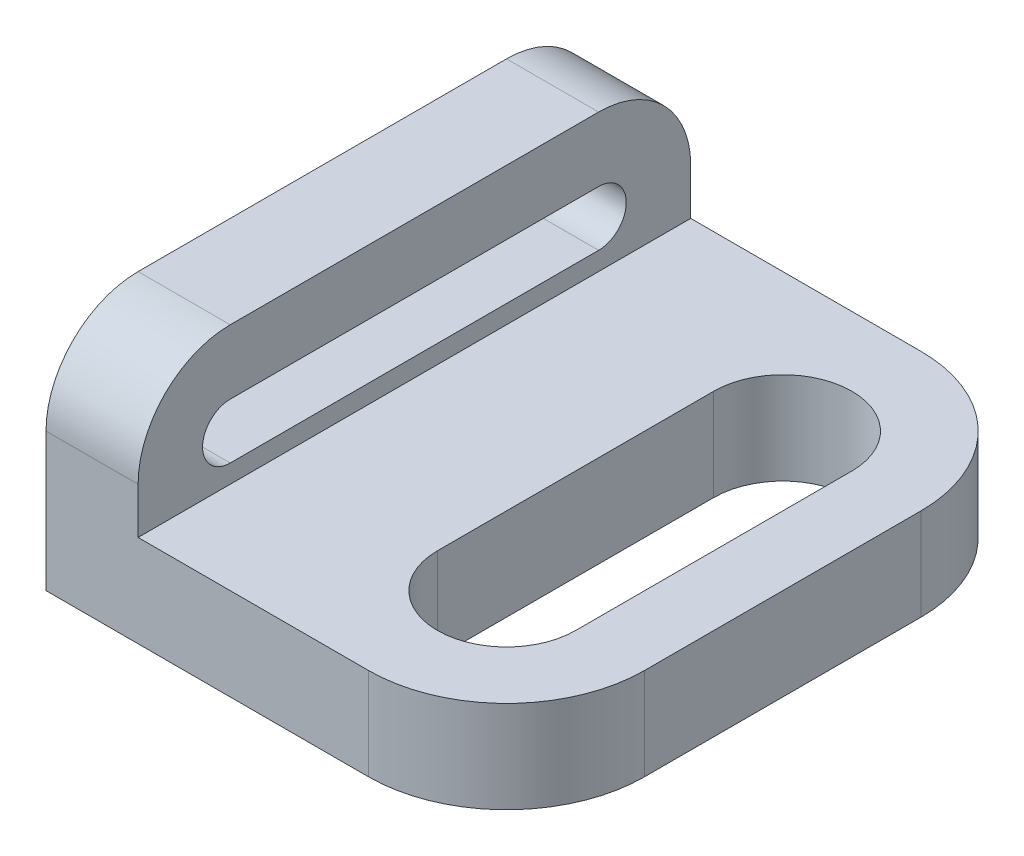
ISO-10303-21;
HEADER;
FILE_DESCRIPTION(('STEP AP214'),'2;1');
FILE_NAME('part.step','',(''),(''),'','','');
FILE_SCHEMA(('AUTOMOTIVE_DESIGN { 1 0 10303 214 1 1 1 1 }'));
ENDSEC;
DATA;
#1=APPLICATION_CONTEXT('core data for automotive mechanical design processes');
#2=APPLICATION_PROTOCOL_DEFINITION('international standard','automotive_design',2000,#1);
#3=PRODUCT_CONTEXT('',#1,'mechanical');
#4=PRODUCT('Part','Part','',(#3));
#5=PRODUCT_RELATED_PRODUCT_CATEGORY('part','',(#4));
#6=PRODUCT_DEFINITION_FORMATION('','',#4);
#7=PRODUCT_DEFINITION_CONTEXT('part definition',#1,'design');
#8=PRODUCT_DEFINITION('design','',#6,#7);
#9=PRODUCT_DEFINITION_SHAPE('','',#8);
#10=(LENGTH_UNIT() NAMED_UNIT(*) SI_UNIT(.MILLI.,.METRE.));
#11=(NAMED_UNIT(*) PLANE_ANGLE_UNIT() SI_UNIT($,.RADIAN.));
#12=(NAMED_UNIT(*) SI_UNIT($,.STERADIAN.) SOLID_ANGLE_UNIT());
#13=UNCERTAINTY_MEASURE_WITH_UNIT(LENGTH_MEASURE(1.E-05),#10,'distance_accuracy_value','');
#14=(GEOMETRIC_REPRESENTATION_CONTEXT(3) GLOBAL_UNCERTAINTY_ASSIGNED_CONTEXT((#13)) GLOBAL_UNIT_ASSIGNED_CONTEXT((#10,
#11,#12)) REPRESENTATION_CONTEXT('',''));
#15=CARTESIAN_POINT('',(0.,0.,0.));
#16=DIRECTION('',(0.,0.,1.));
#17=DIRECTION('',(1.,0.,0.));
#18=AXIS2_PLACEMENT_3D('',#15,#16,#17);
#19=CARTESIAN_POINT('',(0.,20.,0.));
#20=DIRECTION('',(0.,1.,0.));
#21=DIRECTION('',(0.,0.,1.));
#22=AXIS2_PLACEMENT_3D('',#19,#20,#21);
#23=PLANE('',#22);
#24=DIRECTION('',(0.,0.,-1.));
#25=VECTOR('',#24,1.);
#26=CARTESIAN_POINT('',(-30.,20.,-60.));
#27=LINE('',#26,#25);
#28=CARTESIAN_POINT('',(-30.,20.,60.));
#29=VERTEX_POINT('',#28);
#30=CARTESIAN_POINT('',(-30.,20.,-60.));
#31=VERTEX_POINT('',#30);
#32=EDGE_CURVE('E201',#29,#31,#27,.T.);
#33=ORIENTED_EDGE('',*,*,#32,.F.);
#34=DIRECTION('',(1.,0.,0.));
#35=VECTOR('',#34,1.);
#36=CARTESIAN_POINT('',(-50.,20.,60.));
#37=LINE('',#36,#35);
#38=CARTESIAN_POINT('',(20.,20.,60.));
#39=VERTEX_POINT('',#38);
#40=EDGE_CURVE('E253',#29,#39,#37,.T.);
#41=ORIENTED_EDGE('',*,*,#40,.T.);
#42=CARTESIAN_POINT('',(20.,20.,30.));
#43=DIRECTION('',(0.,1.,0.));
#44=DIRECTION('',(0.,0.,1.));
#45=AXIS2_PLACEMENT_3D('',#42,#43,#44);
#46=CIRCLE('',#45,30.);
#47=CARTESIAN_POINT('',(50.,20.,30.));
#48=VERTEX_POINT('',#47);
#49=EDGE_CURVE('E287',#39,#48,#46,.T.);
#50=ORIENTED_EDGE('',*,*,#49,.T.);
#51=DIRECTION('',(0.,0.,-1.));
#52=VECTOR('',#51,1.);
#53=CARTESIAN_POINT('',(50.,20.,-60.));
#54=LINE('',#53,#52);
#55=CARTESIAN_POINT('',(50.,20.,-30.));
#56=VERTEX_POINT('',#55);
#57=EDGE_CURVE('E247',#48,#56,#54,.T.);
#58=ORIENTED_EDGE('',*,*,#57,.T.);
#59=CARTESIAN_POINT('',(20.,20.,-30.));
#60=DIRECTION('',(0.,1.,0.));
#61=DIRECTION('',(0.,0.,1.));
#62=AXIS2_PLACEMENT_3D('',#59,#60,#61);
#63=CIRCLE('',#62,30.);
#64=CARTESIAN_POINT('',(20.,20.,-60.));
#65=VERTEX_POINT('',#64);
#66=EDGE_CURVE('E277',#56,#65,#63,.T.);
#67=ORIENTED_EDGE('',*,*,#66,.T.);
#68=DIRECTION('',(-1.,0.,0.));
#69=VECTOR('',#68,1.);
#70=CARTESIAN_POINT('',(-50.,20.,-60.));
#71=LINE('',#70,#69);
#72=EDGE_CURVE('E249',#65,#31,#71,.T.);
#73=ORIENTED_EDGE('',*,*,#72,.T.);
#74=EDGE_LOOP('',(#33,#41,#50,#58,#67,#73));
#75=FACE_BOUND('',#74,.T.);
#76=DIRECTION('',(0.,0.,1.));
#77=VECTOR('',#76,1.);
#78=CARTESIAN_POINT('',(5.,20.,-30.));
#79=LINE('',#78,#77);
#80=CARTESIAN_POINT('',(5.,20.,-30.));
#81=VERTEX_POINT('',#80);
#82=CARTESIAN_POINT('',(5.,20.,30.));
#83=VERTEX_POINT('',#82);
#84=EDGE_CURVE('E218',#81,#83,#79,.T.);
#85=ORIENTED_EDGE('',*,*,#84,.F.);
#86=CARTESIAN_POINT('',(20.,20.,-30.));
#87=DIRECTION('',(0.,1.,0.));
#88=DIRECTION('',(0.,0.,1.));
#89=AXIS2_PLACEMENT_3D('',#86,#87,#88);
#90=CIRCLE('',#89,15.);
#91=CARTESIAN_POINT('',(35.,20.,-30.));
#92=VERTEX_POINT('',#91);
#93=EDGE_CURVE('E216',#92,#81,#90,.T.);
#94=ORIENTED_EDGE('',*,*,#93,.F.);
#95=DIRECTION('',(0.,0.,-1.));
#96=VECTOR('',#95,1.);
#97=CARTESIAN_POINT('',(35.,20.,-30.));
#98=LINE('',#97,#96);
#99=CARTESIAN_POINT('',(35.,20.,30.));
#100=VERTEX_POINT('',#99);
#101=EDGE_CURVE('E224',#100,#92,#98,.T.);
#102=ORIENTED_EDGE('',*,*,#101,.F.);
#103=CARTESIAN_POINT('',(20.,20.,30.));
#104=DIRECTION('',(0.,1.,0.));
#105=DIRECTION('',(0.,0.,1.));
#106=AXIS2_PLACEMENT_3D('',#103,#104,#105);
#107=CIRCLE('',#106,15.);
#108=EDGE_CURVE('E221',#83,#100,#107,.T.);
#109=ORIENTED_EDGE('',*,*,#108,.F.);
#110=EDGE_LOOP('',(#85,#94,#102,#109));
#111=FACE_BOUND('',#110,.T.);
#112=ADVANCED_FACE('F39',(#75,#111),#23,.T.);
#113=CARTESIAN_POINT('',(0.,0.,0.));
#114=DIRECTION('',(0.,1.,0.));
#115=DIRECTION('',(0.,0.,1.));
#116=AXIS2_PLACEMENT_3D('',#113,#114,#115);
#117=PLANE('',#116);
#118=DIRECTION('',(0.,0.,-1.));
#119=VECTOR('',#118,1.);
#120=CARTESIAN_POINT('',(50.,0.,-60.));
#121=LINE('',#120,#119);
#122=CARTESIAN_POINT('',(50.,0.,30.));
#123=VERTEX_POINT('',#122);
#124=CARTESIAN_POINT('',(50.,0.,-30.));
#125=VERTEX_POINT('',#124);
#126=EDGE_CURVE('E246',#123,#125,#121,.T.);
#127=ORIENTED_EDGE('',*,*,#126,.F.);
#128=CARTESIAN_POINT('',(20.,0.,30.));
#129=DIRECTION('',(0.,1.,0.));
#130=DIRECTION('',(0.,0.,1.));
#131=AXIS2_PLACEMENT_3D('',#128,#129,#130);
#132=CIRCLE('',#131,30.);
#133=CARTESIAN_POINT('',(20.,0.,60.));
#134=VERTEX_POINT('',#133);
#135=EDGE_CURVE('E282',#123,#134,#132,.F.);
#136=ORIENTED_EDGE('',*,*,#135,.T.);
#137=DIRECTION('',(1.,0.,0.));
#138=VECTOR('',#137,1.);
#139=CARTESIAN_POINT('',(-50.,0.,60.));
#140=LINE('',#139,#138);
#141=CARTESIAN_POINT('',(-50.,0.,60.));
#142=VERTEX_POINT('',#141);
#143=EDGE_CURVE('E250',#142,#134,#140,.T.);
#144=ORIENTED_EDGE('',*,*,#143,.F.);
#145=DIRECTION('',(0.,0.,1.));
#146=VECTOR('',#145,1.);
#147=CARTESIAN_POINT('',(-50.,0.,-60.));
#148=LINE('',#147,#146);
#149=CARTESIAN_POINT('',(-50.,0.,-60.));
#150=VERTEX_POINT('',#149);
#151=EDGE_CURVE('E260',#150,#142,#148,.T.);
#152=ORIENTED_EDGE('',*,*,#151,.F.);
#153=DIRECTION('',(-1.,0.,0.));
#154=VECTOR('',#153,1.);
#155=CARTESIAN_POINT('',(-50.,0.,-60.));
#156=LINE('',#155,#154);
#157=CARTESIAN_POINT('',(20.,0.,-60.));
#158=VERTEX_POINT('',#157);
#159=EDGE_CURVE('E257',#158,#150,#156,.T.);
#160=ORIENTED_EDGE('',*,*,#159,.F.);
#161=CARTESIAN_POINT('',(20.,0.,-30.));
#162=DIRECTION('',(0.,1.,0.));
#163=DIRECTION('',(0.,0.,1.));
#164=AXIS2_PLACEMENT_3D('',#161,#162,#163);
#165=CIRCLE('',#164,30.);
#166=EDGE_CURVE('E271',#158,#125,#165,.F.);
#167=ORIENTED_EDGE('',*,*,#166,.T.);
#168=EDGE_LOOP('',(#127,#136,#144,#152,#160,#167));
#169=FACE_BOUND('',#168,.T.);
#170=CARTESIAN_POINT('',(20.,0.,-30.));
#171=DIRECTION('',(0.,1.,0.));
#172=DIRECTION('',(0.,0.,1.));
#173=AXIS2_PLACEMENT_3D('',#170,#171,#172);
#174=CIRCLE('',#173,15.);
#175=CARTESIAN_POINT('',(35.,0.,-30.));
#176=VERTEX_POINT('',#175);
#177=CARTESIAN_POINT('',(5.,0.,-30.));
#178=VERTEX_POINT('',#177);
#179=EDGE_CURVE('E215',#176,#178,#174,.T.);
#180=ORIENTED_EDGE('',*,*,#179,.T.);
#181=DIRECTION('',(0.,0.,1.));
#182=VECTOR('',#181,1.);
#183=CARTESIAN_POINT('',(5.,0.,-30.));
#184=LINE('',#183,#182);
#185=CARTESIAN_POINT('',(5.,0.,30.));
#186=VERTEX_POINT('',#185);
#187=EDGE_CURVE('E229',#178,#186,#184,.T.);
#188=ORIENTED_EDGE('',*,*,#187,.T.);
#189=CARTESIAN_POINT('',(20.,0.,30.));
#190=DIRECTION('',(0.,1.,0.));
#191=DIRECTION('',(0.,0.,1.));
#192=AXIS2_PLACEMENT_3D('',#189,#190,#191);
#193=CIRCLE('',#192,15.);
#194=CARTESIAN_POINT('',(35.,0.,30.));
#195=VERTEX_POINT('',#194);
#196=EDGE_CURVE('E232',#186,#195,#193,.T.);
#197=ORIENTED_EDGE('',*,*,#196,.T.);
#198=DIRECTION('',(0.,0.,-1.));
#199=VECTOR('',#198,1.);
#200=CARTESIAN_POINT('',(35.,0.,-30.));
#201=LINE('',#200,#199);
#202=EDGE_CURVE('E219',#195,#176,#201,.T.);
#203=ORIENTED_EDGE('',*,*,#202,.T.);
#204=EDGE_LOOP('',(#180,#188,#197,#203));
#205=FACE_BOUND('',#204,.T.);
#206=ADVANCED_FACE('F329',(#169,#205),#117,.F.);
#207=CARTESIAN_POINT('',(50.,20.,-60.));
#208=DIRECTION('',(-1.,0.,0.));
#209=DIRECTION('',(0.,0.,1.));
#210=AXIS2_PLACEMENT_3D('',#207,#208,#209);
#211=PLANE('',#210);
#212=ORIENTED_EDGE('',*,*,#57,.F.);
#213=DIRECTION('',(0.,-1.,0.));
#214=VECTOR('',#213,1.);
#215=CARTESIAN_POINT('',(50.,20.,30.));
#216=LINE('',#215,#214);
#217=EDGE_CURVE('E279',#48,#123,#216,.T.);
#218=ORIENTED_EDGE('',*,*,#217,.T.);
#219=ORIENTED_EDGE('',*,*,#126,.T.);
#220=DIRECTION('',(0.,-1.,0.));
#221=VECTOR('',#220,1.);
#222=CARTESIAN_POINT('',(50.,20.,-30.));
#223=LINE('',#222,#221);
#224=EDGE_CURVE('E274',#125,#56,#223,.F.);
#225=ORIENTED_EDGE('',*,*,#224,.T.);
#226=EDGE_LOOP('',(#212,#218,#219,#225));
#227=FACE_BOUND('',#226,.T.);
#228=ADVANCED_FACE('F335',(#227),#211,.F.);
#229=CARTESIAN_POINT('',(-50.,20.,-60.));
#230=DIRECTION('',(0.,0.,1.));
#231=DIRECTION('',(1.,0.,0.));
#232=AXIS2_PLACEMENT_3D('',#229,#230,#231);
#233=PLANE('',#232);
#234=DIRECTION('',(0.,-1.,0.));
#235=VECTOR('',#234,1.);
#236=CARTESIAN_POINT('',(-50.,20.,-60.));
#237=LINE('',#236,#235);
#238=CARTESIAN_POINT('',(-50.,30.,-60.));
#239=VERTEX_POINT('',#238);
#240=EDGE_CURVE('E266',#239,#150,#237,.T.);
#241=ORIENTED_EDGE('',*,*,#240,.F.);
#242=DIRECTION('',(-1.,0.,0.));
#243=VECTOR('',#242,1.);
#244=CARTESIAN_POINT('',(-30.,30.,-60.));
#245=LINE('',#244,#243);
#246=CARTESIAN_POINT('',(-30.,30.,-60.));
#247=VERTEX_POINT('',#246);
#248=EDGE_CURVE('E11',#239,#247,#245,.F.);
#249=ORIENTED_EDGE('',*,*,#248,.T.);
#250=DIRECTION('',(0.,-1.,0.));
#251=VECTOR('',#250,1.);
#252=CARTESIAN_POINT('',(-30.,50.,-60.));
#253=LINE('',#252,#251);
#254=EDGE_CURVE('E213',#247,#31,#253,.T.);
#255=ORIENTED_EDGE('',*,*,#254,.T.);
#256=ORIENTED_EDGE('',*,*,#72,.F.);
#257=DIRECTION('',(0.,-1.,0.));
#258=VECTOR('',#257,1.);
#259=CARTESIAN_POINT('',(20.,20.,-60.));
#260=LINE('',#259,#258);
#261=EDGE_CURVE('E268',#65,#158,#260,.T.);
#262=ORIENTED_EDGE('',*,*,#261,.T.);
#263=ORIENTED_EDGE('',*,*,#159,.T.);
#264=EDGE_LOOP('',(#241,#249,#255,#256,#262,#263));
#265=FACE_BOUND('',#264,.T.);
#266=ADVANCED_FACE('F323',(#265),#233,.F.);
#267=CARTESIAN_POINT('',(-50.,20.,-60.));
#268=DIRECTION('',(1.,0.,0.));
#269=DIRECTION('',(0.,0.,-1.));
#270=AXIS2_PLACEMENT_3D('',#267,#268,#269);
#271=PLANE('',#270);
#272=DIRECTION('',(0.,0.,-1.));
#273=VECTOR('',#272,1.);
#274=CARTESIAN_POINT('',(-50.,36.,40.));
#275=LINE('',#274,#273);
#276=CARTESIAN_POINT('',(-50.,36.,40.));
#277=VERTEX_POINT('',#276);
#278=CARTESIAN_POINT('',(-50.,36.,-40.));
#279=VERTEX_POINT('',#278);
#280=EDGE_CURVE('E532',#277,#279,#275,.T.);
#281=ORIENTED_EDGE('',*,*,#280,.F.);
#282=CARTESIAN_POINT('',(-50.,30.,40.));
#283=DIRECTION('',(1.,0.,0.));
#284=DIRECTION('',(0.,0.,-1.));
#285=AXIS2_PLACEMENT_3D('',#282,#283,#284);
#286=CIRCLE('',#285,6.);
#287=CARTESIAN_POINT('',(-50.,24.,40.));
#288=VERTEX_POINT('',#287);
#289=EDGE_CURVE('E202',#288,#277,#286,.F.);
#290=ORIENTED_EDGE('',*,*,#289,.F.);
#291=DIRECTION('',(0.,0.,1.));
#292=VECTOR('',#291,1.);
#293=CARTESIAN_POINT('',(-50.,24.,40.));
#294=LINE('',#293,#292);
#295=CARTESIAN_POINT('',(-50.,24.,-40.));
#296=VERTEX_POINT('',#295);
#297=EDGE_CURVE('E199',#296,#288,#294,.T.);
#298=ORIENTED_EDGE('',*,*,#297,.F.);
#299=CARTESIAN_POINT('',(-50.,30.,-40.));
#300=DIRECTION('',(1.,0.,0.));
#301=DIRECTION('',(0.,0.,-1.));
#302=AXIS2_PLACEMENT_3D('',#299,#300,#301);
#303=CIRCLE('',#302,6.);
#304=EDGE_CURVE('E172',#279,#296,#303,.F.);
#305=ORIENTED_EDGE('',*,*,#304,.F.);
#306=EDGE_LOOP('',(#281,#290,#298,#305));
#307=FACE_BOUND('',#306,.T.);
#308=DIRECTION('',(0.,-1.,0.));
#309=VECTOR('',#308,1.);
#310=CARTESIAN_POINT('',(-50.,20.,60.));
#311=LINE('',#310,#309);
#312=CARTESIAN_POINT('',(-50.,30.,60.));
#313=VERTEX_POINT('',#312);
#314=EDGE_CURVE('E255',#313,#142,#311,.T.);
#315=ORIENTED_EDGE('',*,*,#314,.F.);
#316=CARTESIAN_POINT('',(-50.,30.,40.));
#317=DIRECTION('',(1.,0.,0.));
#318=DIRECTION('',(0.,0.,-1.));
#319=AXIS2_PLACEMENT_3D('',#316,#317,#318);
#320=CIRCLE('',#319,20.);
#321=CARTESIAN_POINT('',(-50.,50.,40.));
#322=VERTEX_POINT('',#321);
#323=EDGE_CURVE('E47',#313,#322,#320,.F.);
#324=ORIENTED_EDGE('',*,*,#323,.T.);
#325=DIRECTION('',(0.,0.,1.));
#326=VECTOR('',#325,1.);
#327=CARTESIAN_POINT('',(-50.,50.,-60.));
#328=LINE('',#327,#326);
#329=CARTESIAN_POINT('',(-50.,50.,-40.));
#330=VERTEX_POINT('',#329);
#331=EDGE_CURVE('E206',#330,#322,#328,.T.);
#332=ORIENTED_EDGE('',*,*,#331,.F.);
#333=CARTESIAN_POINT('',(-50.,30.,-40.));
#334=DIRECTION('',(1.,0.,0.));
#335=DIRECTION('',(0.,0.,-1.));
#336=AXIS2_PLACEMENT_3D('',#333,#334,#335);
#337=CIRCLE('',#336,20.);
#338=EDGE_CURVE('E54',#330,#239,#337,.F.);
#339=ORIENTED_EDGE('',*,*,#338,.T.);
#340=ORIENTED_EDGE('',*,*,#240,.T.);
#341=ORIENTED_EDGE('',*,*,#151,.T.);
#342=EDGE_LOOP('',(#315,#324,#332,#339,#340,#341));
#343=FACE_BOUND('',#342,.T.);
#344=ADVANCED_FACE('F301',(#307,#343),#271,.F.);
#345=CARTESIAN_POINT('',(-50.,20.,60.));
#346=DIRECTION('',(0.,0.,-1.));
#347=DIRECTION('',(-1.,0.,0.));
#348=AXIS2_PLACEMENT_3D('',#345,#346,#347);
#349=PLANE('',#348);
#350=DIRECTION('',(0.,-1.,0.));
#351=VECTOR('',#350,1.);
#352=CARTESIAN_POINT('',(-30.,50.,60.));
#353=LINE('',#352,#351);
#354=CARTESIAN_POINT('',(-30.,30.,60.));
#355=VERTEX_POINT('',#354);
#356=EDGE_CURVE('E209',#355,#29,#353,.T.);
#357=ORIENTED_EDGE('',*,*,#356,.F.);
#358=DIRECTION('',(1.,0.,0.));
#359=VECTOR('',#358,1.);
#360=CARTESIAN_POINT('',(-50.,30.,60.));
#361=LINE('',#360,#359);
#362=EDGE_CURVE('E62',#355,#313,#361,.F.);
#363=ORIENTED_EDGE('',*,*,#362,.T.);
#364=ORIENTED_EDGE('',*,*,#314,.T.);
#365=ORIENTED_EDGE('',*,*,#143,.T.);
#366=DIRECTION('',(0.,-1.,0.));
#367=VECTOR('',#366,1.);
#368=CARTESIAN_POINT('',(20.,20.,60.));
#369=LINE('',#368,#367);
#370=EDGE_CURVE('E284',#134,#39,#369,.F.);
#371=ORIENTED_EDGE('',*,*,#370,.T.);
#372=ORIENTED_EDGE('',*,*,#40,.F.);
#373=EDGE_LOOP('',(#357,#363,#364,#365,#371,#372));
#374=FACE_BOUND('',#373,.T.);
#375=ADVANCED_FACE('F311',(#374),#349,.F.);
#376=CARTESIAN_POINT('',(20.,20.,-30.));
#377=DIRECTION('',(0.,-1.,0.));
#378=DIRECTION('',(0.,0.,-1.));
#379=AXIS2_PLACEMENT_3D('',#376,#377,#378);
#380=CYLINDRICAL_SURFACE('',#379,15.);
#381=ORIENTED_EDGE('',*,*,#179,.F.);
#382=DIRECTION('',(0.,-1.,0.));
#383=VECTOR('',#382,1.);
#384=CARTESIAN_POINT('',(35.,20.,-30.));
#385=LINE('',#384,#383);
#386=EDGE_CURVE('E226',#92,#176,#385,.T.);
#387=ORIENTED_EDGE('',*,*,#386,.F.);
#388=ORIENTED_EDGE('',*,*,#93,.T.);
#389=DIRECTION('',(0.,-1.,0.));
#390=VECTOR('',#389,1.);
#391=CARTESIAN_POINT('',(5.,20.,-30.));
#392=LINE('',#391,#390);
#393=EDGE_CURVE('E243',#81,#178,#392,.T.);
#394=ORIENTED_EDGE('',*,*,#393,.T.);
#395=EDGE_LOOP('',(#381,#387,#388,#394));
#396=FACE_BOUND('',#395,.T.);
#397=ADVANCED_FACE('F361',(#396),#380,.F.);
#398=CARTESIAN_POINT('',(5.,20.,-30.));
#399=DIRECTION('',(1.,0.,0.));
#400=DIRECTION('',(0.,0.,-1.));
#401=AXIS2_PLACEMENT_3D('',#398,#399,#400);
#402=PLANE('',#401);
#403=ORIENTED_EDGE('',*,*,#187,.F.);
#404=ORIENTED_EDGE('',*,*,#393,.F.);
#405=ORIENTED_EDGE('',*,*,#84,.T.);
#406=DIRECTION('',(0.,-1.,0.));
#407=VECTOR('',#406,1.);
#408=CARTESIAN_POINT('',(5.,20.,30.));
#409=LINE('',#408,#407);
#410=EDGE_CURVE('E241',#83,#186,#409,.T.);
#411=ORIENTED_EDGE('',*,*,#410,.T.);
#412=EDGE_LOOP('',(#403,#404,#405,#411));
#413=FACE_BOUND('',#412,.T.);
#414=ADVANCED_FACE('F480',(#413),#402,.T.);
#415=CARTESIAN_POINT('',(20.,20.,30.));
#416=DIRECTION('',(0.,-1.,0.));
#417=DIRECTION('',(0.,0.,-1.));
#418=AXIS2_PLACEMENT_3D('',#415,#416,#417);
#419=CYLINDRICAL_SURFACE('',#418,15.);
#420=ORIENTED_EDGE('',*,*,#196,.F.);
#421=ORIENTED_EDGE('',*,*,#410,.F.);
#422=ORIENTED_EDGE('',*,*,#108,.T.);
#423=DIRECTION('',(0.,-1.,0.));
#424=VECTOR('',#423,1.);
#425=CARTESIAN_POINT('',(35.,20.,30.));
#426=LINE('',#425,#424);
#427=EDGE_CURVE('E239',#100,#195,#426,.T.);
#428=ORIENTED_EDGE('',*,*,#427,.T.);
#429=EDGE_LOOP('',(#420,#421,#422,#428));
#430=FACE_BOUND('',#429,.T.);
#431=ADVANCED_FACE('F350',(#430),#419,.F.);
#432=CARTESIAN_POINT('',(35.,20.,-30.));
#433=DIRECTION('',(-1.,0.,0.));
#434=DIRECTION('',(0.,0.,1.));
#435=AXIS2_PLACEMENT_3D('',#432,#433,#434);
#436=PLANE('',#435);
#437=ORIENTED_EDGE('',*,*,#202,.F.);
#438=ORIENTED_EDGE('',*,*,#427,.F.);
#439=ORIENTED_EDGE('',*,*,#101,.T.);
#440=ORIENTED_EDGE('',*,*,#386,.T.);
#441=EDGE_LOOP('',(#437,#438,#439,#440));
#442=FACE_BOUND('',#441,.T.);
#443=ADVANCED_FACE('F342',(#442),#436,.T.);
#444=CARTESIAN_POINT('',(20.,20.,-30.));
#445=DIRECTION('',(0.,-1.,0.));
#446=DIRECTION('',(0.,0.,-1.));
#447=AXIS2_PLACEMENT_3D('',#444,#445,#446);
#448=CYLINDRICAL_SURFACE('',#447,30.);
#449=ORIENTED_EDGE('',*,*,#66,.F.);
#450=ORIENTED_EDGE('',*,*,#224,.F.);
#451=ORIENTED_EDGE('',*,*,#166,.F.);
#452=ORIENTED_EDGE('',*,*,#261,.F.);
#453=EDGE_LOOP('',(#449,#450,#451,#452));
#454=FACE_BOUND('',#453,.T.);
#455=ADVANCED_FACE('F340',(#454),#448,.T.);
#456=CARTESIAN_POINT('',(20.,20.,30.));
#457=DIRECTION('',(0.,-1.,0.));
#458=DIRECTION('',(0.,0.,-1.));
#459=AXIS2_PLACEMENT_3D('',#456,#457,#458);
#460=CYLINDRICAL_SURFACE('',#459,30.);
#461=ORIENTED_EDGE('',*,*,#49,.F.);
#462=ORIENTED_EDGE('',*,*,#370,.F.);
#463=ORIENTED_EDGE('',*,*,#135,.F.);
#464=ORIENTED_EDGE('',*,*,#217,.F.);
#465=EDGE_LOOP('',(#461,#462,#463,#464));
#466=FACE_BOUND('',#465,.T.);
#467=ADVANCED_FACE('F332',(#466),#460,.T.);
#468=CARTESIAN_POINT('',(-30.,50.,-60.));
#469=DIRECTION('',(-1.,0.,0.));
#470=DIRECTION('',(0.,0.,1.));
#471=AXIS2_PLACEMENT_3D('',#468,#469,#470);
#472=PLANE('',#471);
#473=DIRECTION('',(0.,0.,-1.));
#474=VECTOR('',#473,1.);
#475=CARTESIAN_POINT('',(-30.,24.,40.));
#476=LINE('',#475,#474);
#477=CARTESIAN_POINT('',(-30.,24.,40.));
#478=VERTEX_POINT('',#477);
#479=CARTESIAN_POINT('',(-30.,24.,-40.));
#480=VERTEX_POINT('',#479);
#481=EDGE_CURVE('E180',#478,#480,#476,.T.);
#482=ORIENTED_EDGE('',*,*,#481,.F.);
#483=CARTESIAN_POINT('',(-30.,30.,40.));
#484=DIRECTION('',(1.,0.,0.));
#485=DIRECTION('',(0.,0.,-1.));
#486=AXIS2_PLACEMENT_3D('',#483,#484,#485);
#487=CIRCLE('',#486,6.);
#488=CARTESIAN_POINT('',(-30.,36.,40.));
#489=VERTEX_POINT('',#488);
#490=EDGE_CURVE('E185',#489,#478,#487,.T.);
#491=ORIENTED_EDGE('',*,*,#490,.F.);
#492=DIRECTION('',(0.,0.,1.));
#493=VECTOR('',#492,1.);
#494=CARTESIAN_POINT('',(-30.,36.,40.));
#495=LINE('',#494,#493);
#496=CARTESIAN_POINT('',(-30.,36.,-40.));
#497=VERTEX_POINT('',#496);
#498=EDGE_CURVE('E190',#497,#489,#495,.T.);
#499=ORIENTED_EDGE('',*,*,#498,.F.);
#500=CARTESIAN_POINT('',(-30.,30.,-40.));
#501=DIRECTION('',(1.,0.,0.));
#502=DIRECTION('',(0.,0.,-1.));
#503=AXIS2_PLACEMENT_3D('',#500,#501,#502);
#504=CIRCLE('',#503,6.);
#505=EDGE_CURVE('E169',#480,#497,#504,.T.);
#506=ORIENTED_EDGE('',*,*,#505,.F.);
#507=EDGE_LOOP('',(#482,#491,#499,#506));
#508=FACE_BOUND('',#507,.T.);
#509=DIRECTION('',(0.,0.,-1.));
#510=VECTOR('',#509,1.);
#511=CARTESIAN_POINT('',(-30.,50.,-60.));
#512=LINE('',#511,#510);
#513=CARTESIAN_POINT('',(-30.,50.,40.));
#514=VERTEX_POINT('',#513);
#515=CARTESIAN_POINT('',(-30.,50.,-40.));
#516=VERTEX_POINT('',#515);
#517=EDGE_CURVE('E203',#514,#516,#512,.T.);
#518=ORIENTED_EDGE('',*,*,#517,.F.);
#519=CARTESIAN_POINT('',(-30.,30.,40.));
#520=DIRECTION('',(-1.,0.,0.));
#521=DIRECTION('',(0.,0.,1.));
#522=AXIS2_PLACEMENT_3D('',#519,#520,#521);
#523=CIRCLE('',#522,20.);
#524=EDGE_CURVE('E297',#514,#355,#523,.F.);
#525=ORIENTED_EDGE('',*,*,#524,.T.);
#526=ORIENTED_EDGE('',*,*,#356,.T.);
#527=ORIENTED_EDGE('',*,*,#32,.T.);
#528=ORIENTED_EDGE('',*,*,#254,.F.);
#529=CARTESIAN_POINT('',(-30.,30.,-40.));
#530=DIRECTION('',(-1.,0.,0.));
#531=DIRECTION('',(0.,0.,1.));
#532=AXIS2_PLACEMENT_3D('',#529,#530,#531);
#533=CIRCLE('',#532,20.);
#534=EDGE_CURVE('E295',#247,#516,#533,.F.);
#535=ORIENTED_EDGE('',*,*,#534,.T.);
#536=EDGE_LOOP('',(#518,#525,#526,#527,#528,#535));
#537=FACE_BOUND('',#536,.T.);
#538=ADVANCED_FACE('F187',(#508,#537),#472,.F.);
#539=CARTESIAN_POINT('',(0.,50.,0.));
#540=DIRECTION('',(0.,1.,0.));
#541=DIRECTION('',(0.,0.,1.));
#542=AXIS2_PLACEMENT_3D('',#539,#540,#541);
#543=PLANE('',#542);
#544=ORIENTED_EDGE('',*,*,#331,.T.);
#545=DIRECTION('',(1.,0.,0.));
#546=VECTOR('',#545,1.);
#547=CARTESIAN_POINT('',(-30.,50.,40.));
#548=LINE('',#547,#546);
#549=EDGE_CURVE('E292',#322,#514,#548,.T.);
#550=ORIENTED_EDGE('',*,*,#549,.T.);
#551=ORIENTED_EDGE('',*,*,#517,.T.);
#552=DIRECTION('',(-1.,0.,0.));
#553=VECTOR('',#552,1.);
#554=CARTESIAN_POINT('',(-50.,50.,-40.));
#555=LINE('',#554,#553);
#556=EDGE_CURVE('E289',#516,#330,#555,.T.);
#557=ORIENTED_EDGE('',*,*,#556,.T.);
#558=EDGE_LOOP('',(#544,#550,#551,#557));
#559=FACE_BOUND('',#558,.T.);
#560=ADVANCED_FACE('F305',(#559),#543,.T.);
#561=CARTESIAN_POINT('',(-142.779308037946,30.,40.));
#562=DIRECTION('',(1.,0.,0.));
#563=DIRECTION('',(0.,0.,-1.));
#564=AXIS2_PLACEMENT_3D('',#561,#562,#563);
#565=CYLINDRICAL_SURFACE('',#564,6.);
#566=ORIENTED_EDGE('',*,*,#289,.T.);
#567=DIRECTION('',(1.,0.,0.));
#568=VECTOR('',#567,1.);
#569=CARTESIAN_POINT('',(-142.779308037946,36.,40.));
#570=LINE('',#569,#568);
#571=EDGE_CURVE('E195',#277,#489,#570,.T.);
#572=ORIENTED_EDGE('',*,*,#571,.T.);
#573=ORIENTED_EDGE('',*,*,#490,.T.);
#574=DIRECTION('',(1.,0.,0.));
#575=VECTOR('',#574,1.);
#576=CARTESIAN_POINT('',(-142.779308037946,24.,40.));
#577=LINE('',#576,#575);
#578=EDGE_CURVE('E176',#288,#478,#577,.T.);
#579=ORIENTED_EDGE('',*,*,#578,.F.);
#580=EDGE_LOOP('',(#566,#572,#573,#579));
#581=FACE_BOUND('',#580,.T.);
#582=ADVANCED_FACE('F428',(#581),#565,.F.);
#583=CARTESIAN_POINT('',(-142.779308037946,36.,40.));
#584=DIRECTION('',(0.,1.,0.));
#585=DIRECTION('',(0.,0.,1.));
#586=AXIS2_PLACEMENT_3D('',#583,#584,#585);
#587=PLANE('',#586);
#588=ORIENTED_EDGE('',*,*,#280,.T.);
#589=DIRECTION('',(1.,0.,0.));
#590=VECTOR('',#589,1.);
#591=CARTESIAN_POINT('',(-142.779308037946,36.,-40.));
#592=LINE('',#591,#590);
#593=EDGE_CURVE('E175',#279,#497,#592,.T.);
#594=ORIENTED_EDGE('',*,*,#593,.T.);
#595=ORIENTED_EDGE('',*,*,#498,.T.);
#596=ORIENTED_EDGE('',*,*,#571,.F.);
#597=EDGE_LOOP('',(#588,#594,#595,#596));
#598=FACE_BOUND('',#597,.T.);
#599=ADVANCED_FACE('F437',(#598),#587,.F.);
#600=CARTESIAN_POINT('',(-142.779308037946,30.,-40.));
#601=DIRECTION('',(1.,0.,0.));
#602=DIRECTION('',(0.,0.,-1.));
#603=AXIS2_PLACEMENT_3D('',#600,#601,#602);
#604=CYLINDRICAL_SURFACE('',#603,6.);
#605=ORIENTED_EDGE('',*,*,#304,.T.);
#606=DIRECTION('',(1.,0.,0.));
#607=VECTOR('',#606,1.);
#608=CARTESIAN_POINT('',(-142.779308037946,24.,-40.));
#609=LINE('',#608,#607);
#610=EDGE_CURVE('E164',#296,#480,#609,.T.);
#611=ORIENTED_EDGE('',*,*,#610,.T.);
#612=ORIENTED_EDGE('',*,*,#505,.T.);
#613=ORIENTED_EDGE('',*,*,#593,.F.);
#614=EDGE_LOOP('',(#605,#611,#612,#613));
#615=FACE_BOUND('',#614,.T.);
#616=ADVANCED_FACE('F166',(#615),#604,.F.);
#617=CARTESIAN_POINT('',(-142.779308037946,24.,40.));
#618=DIRECTION('',(0.,-1.,0.));
#619=DIRECTION('',(0.,0.,-1.));
#620=AXIS2_PLACEMENT_3D('',#617,#618,#619);
#621=PLANE('',#620);
#622=ORIENTED_EDGE('',*,*,#297,.T.);
#623=ORIENTED_EDGE('',*,*,#578,.T.);
#624=ORIENTED_EDGE('',*,*,#481,.T.);
#625=ORIENTED_EDGE('',*,*,#610,.F.);
#626=EDGE_LOOP('',(#622,#623,#624,#625));
#627=FACE_BOUND('',#626,.T.);
#628=ADVANCED_FACE('F181',(#627),#621,.F.);
#629=CARTESIAN_POINT('',(0.,30.,40.));
#630=DIRECTION('',(-1.,0.,0.));
#631=DIRECTION('',(0.,0.,1.));
#632=AXIS2_PLACEMENT_3D('',#629,#630,#631);
#633=CYLINDRICAL_SURFACE('',#632,20.);
#634=ORIENTED_EDGE('',*,*,#323,.F.);
#635=ORIENTED_EDGE('',*,*,#362,.F.);
#636=ORIENTED_EDGE('',*,*,#524,.F.);
#637=ORIENTED_EDGE('',*,*,#549,.F.);
#638=EDGE_LOOP('',(#634,#635,#636,#637));
#639=FACE_BOUND('',#638,.T.);
#640=ADVANCED_FACE('F308',(#639),#633,.T.);
#641=CARTESIAN_POINT('',(0.,30.,-40.));
#642=DIRECTION('',(1.,0.,0.));
#643=DIRECTION('',(0.,0.,-1.));
#644=AXIS2_PLACEMENT_3D('',#641,#642,#643);
#645=CYLINDRICAL_SURFACE('',#644,20.);
#646=ORIENTED_EDGE('',*,*,#534,.F.);
#647=ORIENTED_EDGE('',*,*,#248,.F.);
#648=ORIENTED_EDGE('',*,*,#338,.F.);
#649=ORIENTED_EDGE('',*,*,#556,.F.);
#650=EDGE_LOOP('',(#646,#647,#648,#649));
#651=FACE_BOUND('',#650,.T.);
#652=ADVANCED_FACE('F41',(#651),#645,.T.);
#653=CLOSED_SHELL('',(#112,#206,#228,#266,#344,#375,#397,#414,#431,#443,#455,#467,#538,#560,
#582,#599,#616,#628,#640,#652));
#654=MANIFOLD_SOLID_BREP('B2',#653);
#655=ADVANCED_BREP_SHAPE_REPRESENTATION('',(#18,#654),#14);
#656=SHAPE_DEFINITION_REPRESENTATION(#9,#655);
ENDSEC;
END-ISO-10303-21;
